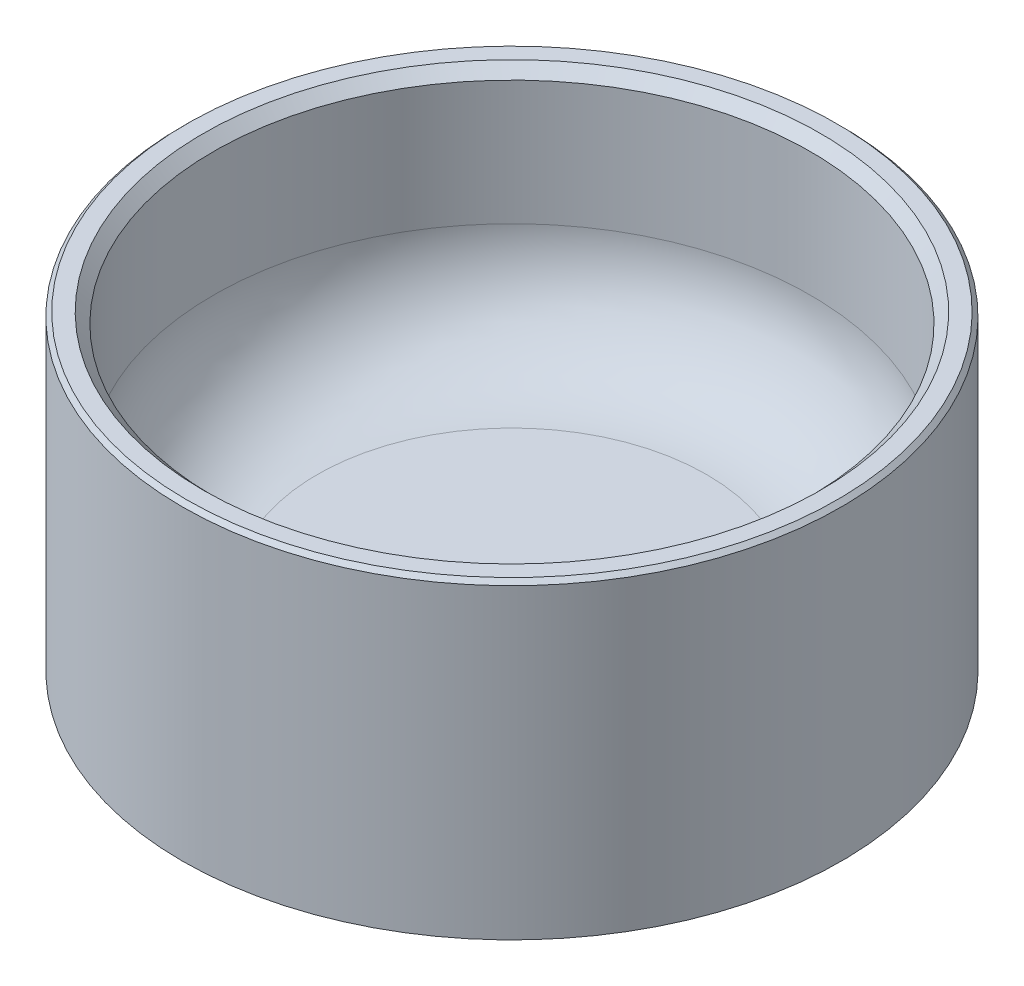
ISO-10303-21;
HEADER;
FILE_DESCRIPTION(('STEP AP214'),'2;1');
FILE_NAME('part.step','',(''),(''),'','','');
FILE_SCHEMA(('AUTOMOTIVE_DESIGN { 1 0 10303 214 1 1 1 1 }'));
ENDSEC;
DATA;
#1=APPLICATION_CONTEXT('core data for automotive mechanical design processes');
#2=APPLICATION_PROTOCOL_DEFINITION('international standard','automotive_design',2000,#1);
#3=PRODUCT_CONTEXT('',#1,'mechanical');
#4=PRODUCT('Part','Part','',(#3));
#5=PRODUCT_RELATED_PRODUCT_CATEGORY('part','',(#4));
#6=PRODUCT_DEFINITION_FORMATION('','',#4);
#7=PRODUCT_DEFINITION_CONTEXT('part definition',#1,'design');
#8=PRODUCT_DEFINITION('design','',#6,#7);
#9=PRODUCT_DEFINITION_SHAPE('','',#8);
#10=(LENGTH_UNIT() NAMED_UNIT(*) SI_UNIT(.MILLI.,.METRE.));
#11=(NAMED_UNIT(*) PLANE_ANGLE_UNIT() SI_UNIT($,.RADIAN.));
#12=(NAMED_UNIT(*) SI_UNIT($,.STERADIAN.) SOLID_ANGLE_UNIT());
#13=UNCERTAINTY_MEASURE_WITH_UNIT(LENGTH_MEASURE(1.E-05),#10,'distance_accuracy_value','');
#14=(GEOMETRIC_REPRESENTATION_CONTEXT(3) GLOBAL_UNCERTAINTY_ASSIGNED_CONTEXT((#13)) GLOBAL_UNIT_ASSIGNED_CONTEXT((#10,
#11,#12)) REPRESENTATION_CONTEXT('',''));
#15=CARTESIAN_POINT('',(0.,0.,0.));
#16=DIRECTION('',(0.,0.,1.));
#17=DIRECTION('',(1.,0.,0.));
#18=AXIS2_PLACEMENT_3D('',#15,#16,#17);
#19=CARTESIAN_POINT('',(-9.39999999999996,1.5,0.));
#20=DIRECTION('',(0.,1.,0.));
#21=DIRECTION('',(0.,0.,1.));
#22=AXIS2_PLACEMENT_3D('',#19,#20,#21);
#23=PLANE('',#22);
#24=CARTESIAN_POINT('',(0.,1.5,0.));
#25=DIRECTION('',(0.,1.,0.));
#26=DIRECTION('',(0.,0.,1.));
#27=AXIS2_PLACEMENT_3D('',#24,#25,#26);
#28=CIRCLE('',#27,9.39999999999996);
#29=CARTESIAN_POINT('',(0.,1.5,9.39999999999996));
#30=VERTEX_POINT('',#29);
#31=EDGE_CURVE('E59',#30,#30,#28,.T.);
#32=ORIENTED_EDGE('',*,*,#31,.T.);
#33=EDGE_LOOP('',(#32));
#34=FACE_BOUND('',#33,.T.);
#35=ADVANCED_FACE('F32',(#34),#23,.T.);
#36=CARTESIAN_POINT('',(0.,6.5,0.));
#37=DIRECTION('',(0.,1.,0.));
#38=DIRECTION('',(0.,0.,1.));
#39=AXIS2_PLACEMENT_3D('',#36,#37,#38);
#40=TOROIDAL_SURFACE('',#39,9.4,5.);
#41=CARTESIAN_POINT('',(0.,6.50000000000003,0.));
#42=DIRECTION('',(0.,1.,0.));
#43=DIRECTION('',(0.,0.,1.));
#44=AXIS2_PLACEMENT_3D('',#41,#42,#43);
#45=CIRCLE('',#44,14.4);
#46=CARTESIAN_POINT('',(0.,6.50000000000003,14.4));
#47=VERTEX_POINT('',#46);
#48=EDGE_CURVE('E63',#47,#47,#45,.T.);
#49=ORIENTED_EDGE('',*,*,#48,.T.);
#50=EDGE_LOOP('',(#49));
#51=FACE_BOUND('',#50,.T.);
#52=ORIENTED_EDGE('',*,*,#31,.F.);
#53=EDGE_LOOP('',(#52));
#54=FACE_BOUND('',#53,.T.);
#55=ADVANCED_FACE('F95',(#51,#54),#40,.F.);
#56=CARTESIAN_POINT('',(0.,1.5,0.));
#57=DIRECTION('',(0.,1.,0.));
#58=DIRECTION('',(0.,0.,1.));
#59=AXIS2_PLACEMENT_3D('',#56,#57,#58);
#60=CYLINDRICAL_SURFACE('',#59,14.4);
#61=CARTESIAN_POINT('',(0.,12.5,0.));
#62=DIRECTION('',(0.,1.,0.));
#63=DIRECTION('',(0.,0.,1.));
#64=AXIS2_PLACEMENT_3D('',#61,#62,#63);
#65=CIRCLE('',#64,14.4);
#66=CARTESIAN_POINT('',(0.,12.5,14.4));
#67=VERTEX_POINT('',#66);
#68=EDGE_CURVE('E53',#67,#67,#65,.T.);
#69=ORIENTED_EDGE('',*,*,#68,.T.);
#70=EDGE_LOOP('',(#69));
#71=FACE_BOUND('',#70,.T.);
#72=ORIENTED_EDGE('',*,*,#48,.F.);
#73=EDGE_LOOP('',(#72));
#74=FACE_BOUND('',#73,.T.);
#75=ADVANCED_FACE('F101',(#71,#74),#60,.F.);
#76=CARTESIAN_POINT('',(-15.9,13.,0.));
#77=DIRECTION('',(0.,1.,0.));
#78=DIRECTION('',(0.,0.,1.));
#79=AXIS2_PLACEMENT_3D('',#76,#77,#78);
#80=PLANE('',#79);
#81=CARTESIAN_POINT('',(0.,13.,0.));
#82=DIRECTION('',(0.,1.,0.));
#83=DIRECTION('',(0.,0.,1.));
#84=AXIS2_PLACEMENT_3D('',#81,#82,#83);
#85=CIRCLE('',#84,15.7);
#86=CARTESIAN_POINT('',(0.,13.,15.7));
#87=VERTEX_POINT('',#86);
#88=EDGE_CURVE('E40',#87,#87,#85,.T.);
#89=ORIENTED_EDGE('',*,*,#88,.T.);
#90=EDGE_LOOP('',(#89));
#91=FACE_BOUND('',#90,.T.);
#92=CARTESIAN_POINT('',(0.,13.,0.));
#93=DIRECTION('',(0.,1.,0.));
#94=DIRECTION('',(0.,0.,1.));
#95=AXIS2_PLACEMENT_3D('',#92,#93,#94);
#96=CIRCLE('',#95,14.9);
#97=CARTESIAN_POINT('',(0.,13.,14.9));
#98=VERTEX_POINT('',#97);
#99=EDGE_CURVE('E47',#98,#98,#96,.F.);
#100=ORIENTED_EDGE('',*,*,#99,.T.);
#101=EDGE_LOOP('',(#100));
#102=FACE_BOUND('',#101,.T.);
#103=ADVANCED_FACE('F107',(#91,#102),#80,.T.);
#104=CARTESIAN_POINT('',(0.,1.5,0.));
#105=DIRECTION('',(0.,1.,0.));
#106=DIRECTION('',(0.,0.,1.));
#107=AXIS2_PLACEMENT_3D('',#104,#105,#106);
#108=CYLINDRICAL_SURFACE('',#107,15.9);
#109=CARTESIAN_POINT('',(0.,12.8,0.));
#110=DIRECTION('',(0.,1.,0.));
#111=DIRECTION('',(0.,0.,1.));
#112=AXIS2_PLACEMENT_3D('',#109,#110,#111);
#113=CIRCLE('',#112,15.9);
#114=CARTESIAN_POINT('',(0.,12.8,15.9));
#115=VERTEX_POINT('',#114);
#116=EDGE_CURVE('E10',#115,#115,#113,.F.);
#117=ORIENTED_EDGE('',*,*,#116,.T.);
#118=EDGE_LOOP('',(#117));
#119=FACE_BOUND('',#118,.T.);
#120=CARTESIAN_POINT('',(0.,-2.,0.));
#121=DIRECTION('',(0.,1.,0.));
#122=DIRECTION('',(0.,0.,1.));
#123=AXIS2_PLACEMENT_3D('',#120,#121,#122);
#124=CIRCLE('',#123,15.9);
#125=CARTESIAN_POINT('',(0.,-2.,15.9));
#126=VERTEX_POINT('',#125);
#127=EDGE_CURVE('E67',#126,#126,#124,.T.);
#128=ORIENTED_EDGE('',*,*,#127,.T.);
#129=EDGE_LOOP('',(#128));
#130=FACE_BOUND('',#129,.T.);
#131=ADVANCED_FACE('F111',(#119,#130),#108,.T.);
#132=CARTESIAN_POINT('',(-14.4,-2.,0.));
#133=DIRECTION('',(0.,-1.,0.));
#134=DIRECTION('',(0.,0.,-1.));
#135=AXIS2_PLACEMENT_3D('',#132,#133,#134);
#136=PLANE('',#135);
#137=CARTESIAN_POINT('',(0.,-2.,0.));
#138=DIRECTION('',(0.,1.,0.));
#139=DIRECTION('',(0.,0.,1.));
#140=AXIS2_PLACEMENT_3D('',#137,#138,#139);
#141=CIRCLE('',#140,14.4);
#142=CARTESIAN_POINT('',(0.,-2.,14.4));
#143=VERTEX_POINT('',#142);
#144=EDGE_CURVE('E71',#143,#143,#141,.T.);
#145=ORIENTED_EDGE('',*,*,#144,.T.);
#146=EDGE_LOOP('',(#145));
#147=FACE_BOUND('',#146,.T.);
#148=ORIENTED_EDGE('',*,*,#127,.F.);
#149=EDGE_LOOP('',(#148));
#150=FACE_BOUND('',#149,.T.);
#151=ADVANCED_FACE('F92',(#147,#150),#136,.T.);
#152=CARTESIAN_POINT('',(0.,-2.,0.));
#153=DIRECTION('',(0.,1.,0.));
#154=DIRECTION('',(0.,0.,1.));
#155=AXIS2_PLACEMENT_3D('',#152,#153,#154);
#156=TOROIDAL_SURFACE('',#155,12.4,2.);
#157=CARTESIAN_POINT('',(0.,0.,0.));
#158=DIRECTION('',(0.,1.,0.));
#159=DIRECTION('',(0.,0.,1.));
#160=AXIS2_PLACEMENT_3D('',#157,#158,#159);
#161=CIRCLE('',#160,12.4);
#162=CARTESIAN_POINT('',(0.,0.,12.4));
#163=VERTEX_POINT('',#162);
#164=EDGE_CURVE('E74',#163,#163,#161,.T.);
#165=ORIENTED_EDGE('',*,*,#164,.T.);
#166=EDGE_LOOP('',(#165));
#167=FACE_BOUND('',#166,.T.);
#168=ORIENTED_EDGE('',*,*,#144,.F.);
#169=EDGE_LOOP('',(#168));
#170=FACE_BOUND('',#169,.T.);
#171=ADVANCED_FACE('F80',(#167,#170),#156,.F.);
#172=CARTESIAN_POINT('',(0.,0.,0.));
#173=DIRECTION('',(0.,-1.,0.));
#174=DIRECTION('',(0.,0.,-1.));
#175=AXIS2_PLACEMENT_3D('',#172,#173,#174);
#176=PLANE('',#175);
#177=ORIENTED_EDGE('',*,*,#164,.F.);
#178=EDGE_LOOP('',(#177));
#179=FACE_BOUND('',#178,.T.);
#180=ADVANCED_FACE('F83',(#179),#176,.T.);
#181=CARTESIAN_POINT('',(0.,12.5,0.));
#182=DIRECTION('',(0.,1.,0.));
#183=DIRECTION('',(0.,0.,1.));
#184=AXIS2_PLACEMENT_3D('',#181,#182,#183);
#185=CONICAL_SURFACE('',#184,14.4,0.785398163397447);
#186=ORIENTED_EDGE('',*,*,#99,.F.);
#187=EDGE_LOOP('',(#186));
#188=FACE_BOUND('',#187,.T.);
#189=ORIENTED_EDGE('',*,*,#68,.F.);
#190=EDGE_LOOP('',(#189));
#191=FACE_BOUND('',#190,.T.);
#192=ADVANCED_FACE('F85',(#188,#191),#185,.F.);
#193=CARTESIAN_POINT('',(0.,13.,0.));
#194=DIRECTION('',(0.,-1.,0.));
#195=DIRECTION('',(0.,0.,-1.));
#196=AXIS2_PLACEMENT_3D('',#193,#194,#195);
#197=CONICAL_SURFACE('',#196,15.7,0.785398163397431);
#198=ORIENTED_EDGE('',*,*,#116,.F.);
#199=EDGE_LOOP('',(#198));
#200=FACE_BOUND('',#199,.T.);
#201=ORIENTED_EDGE('',*,*,#88,.F.);
#202=EDGE_LOOP('',(#201));
#203=FACE_BOUND('',#202,.T.);
#204=ADVANCED_FACE('F34',(#200,#203),#197,.T.);
#205=CLOSED_SHELL('',(#35,#55,#75,#103,#131,#151,#171,#180,#192,#204));
#206=MANIFOLD_SOLID_BREP('B2',#205);
#207=ADVANCED_BREP_SHAPE_REPRESENTATION('',(#18,#206),#14);
#208=SHAPE_DEFINITION_REPRESENTATION(#9,#207);
ENDSEC;
END-ISO-10303-21;
